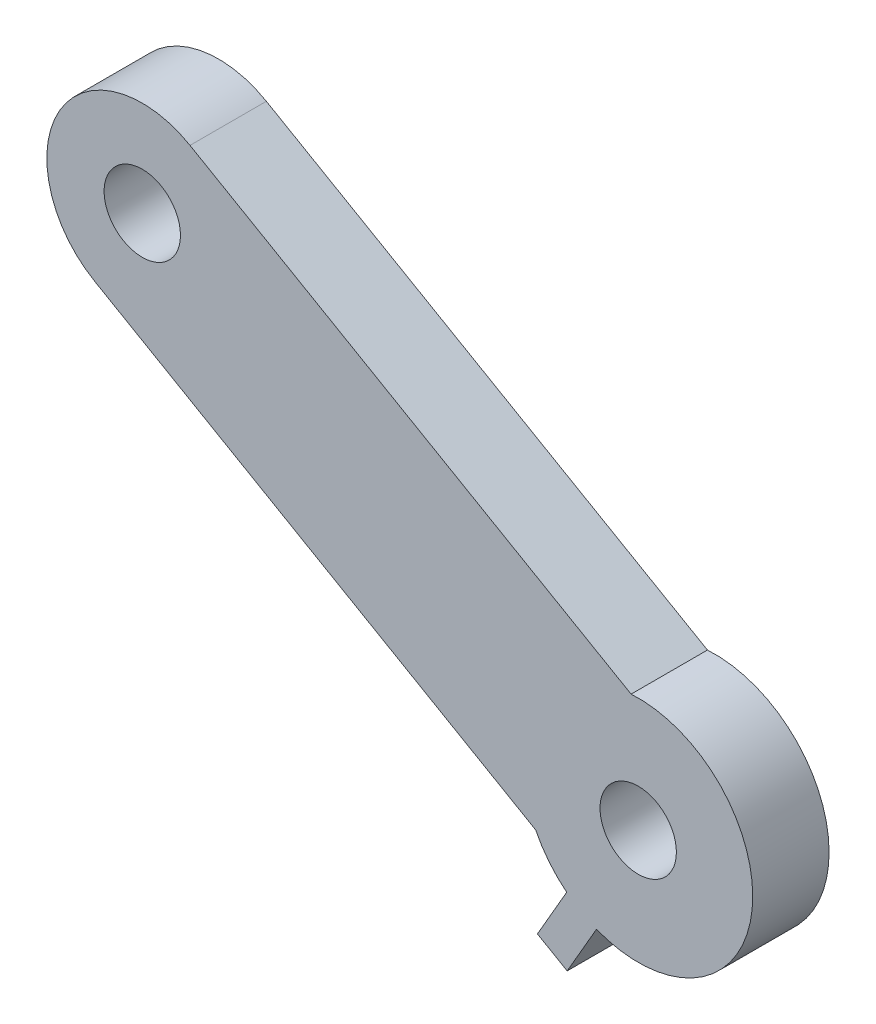
ISO-10303-21;
HEADER;
FILE_DESCRIPTION(('STEP AP214'),'2;1');
FILE_NAME('part.step','',(''),(''),'','','');
FILE_SCHEMA(('AUTOMOTIVE_DESIGN { 1 0 10303 214 1 1 1 1 }'));
ENDSEC;
DATA;
#1=APPLICATION_CONTEXT('core data for automotive mechanical design processes');
#2=APPLICATION_PROTOCOL_DEFINITION('international standard','automotive_design',2000,#1);
#3=PRODUCT_CONTEXT('',#1,'mechanical');
#4=PRODUCT('Part','Part','',(#3));
#5=PRODUCT_RELATED_PRODUCT_CATEGORY('part','',(#4));
#6=PRODUCT_DEFINITION_FORMATION('','',#4);
#7=PRODUCT_DEFINITION_CONTEXT('part definition',#1,'design');
#8=PRODUCT_DEFINITION('design','',#6,#7);
#9=PRODUCT_DEFINITION_SHAPE('','',#8);
#10=(LENGTH_UNIT() NAMED_UNIT(*) SI_UNIT(.MILLI.,.METRE.));
#11=(NAMED_UNIT(*) PLANE_ANGLE_UNIT() SI_UNIT($,.RADIAN.));
#12=(NAMED_UNIT(*) SI_UNIT($,.STERADIAN.) SOLID_ANGLE_UNIT());
#13=UNCERTAINTY_MEASURE_WITH_UNIT(LENGTH_MEASURE(1.E-05),#10,'distance_accuracy_value','');
#14=(GEOMETRIC_REPRESENTATION_CONTEXT(3) GLOBAL_UNCERTAINTY_ASSIGNED_CONTEXT((#13)) GLOBAL_UNIT_ASSIGNED_CONTEXT((#10,
#11,#12)) REPRESENTATION_CONTEXT('',''));
#15=CARTESIAN_POINT('',(0.,0.,0.));
#16=DIRECTION('',(0.,0.,1.));
#17=DIRECTION('',(1.,0.,0.));
#18=AXIS2_PLACEMENT_3D('',#15,#16,#17);
#19=CARTESIAN_POINT('',(0.,0.,20.));
#20=DIRECTION('',(0.,0.,-1.));
#21=DIRECTION('',(-1.,0.,0.));
#22=AXIS2_PLACEMENT_3D('',#19,#20,#21);
#23=CYLINDRICAL_SURFACE('',#22,30.);
#24=CARTESIAN_POINT('',(0.,0.,0.));
#25=DIRECTION('',(0.,0.,1.));
#26=DIRECTION('',(1.,0.,0.));
#27=AXIS2_PLACEMENT_3D('',#24,#25,#26);
#28=CIRCLE('',#27,30.);
#29=CARTESIAN_POINT('',(-26.8614070288252,-13.3590722893387,0.));
#30=VERTEX_POINT('',#29);
#31=CARTESIAN_POINT('',(-18.7274042669941,-23.4368156843154,0.));
#32=VERTEX_POINT('',#31);
#33=EDGE_CURVE('E148',#30,#32,#28,.T.);
#34=ORIENTED_EDGE('',*,*,#33,.T.);
#35=DIRECTION('',(0.,0.,-1.));
#36=VECTOR('',#35,1.);
#37=CARTESIAN_POINT('',(-18.7274042669941,-23.4368156843154,20.));
#38=LINE('',#37,#36);
#39=CARTESIAN_POINT('',(-18.7274042669941,-23.4368156843154,20.));
#40=VERTEX_POINT('',#39);
#41=EDGE_CURVE('E11',#40,#32,#38,.T.);
#42=ORIENTED_EDGE('',*,*,#41,.F.);
#43=CARTESIAN_POINT('',(0.,0.,20.));
#44=DIRECTION('',(0.,0.,1.));
#45=DIRECTION('',(1.,0.,0.));
#46=AXIS2_PLACEMENT_3D('',#43,#44,#45);
#47=CIRCLE('',#46,30.);
#48=CARTESIAN_POINT('',(-26.8614070288252,-13.3590722893387,20.));
#49=VERTEX_POINT('',#48);
#50=EDGE_CURVE('E136',#49,#40,#47,.T.);
#51=ORIENTED_EDGE('',*,*,#50,.F.);
#52=DIRECTION('',(0.,0.,-1.));
#53=VECTOR('',#52,1.);
#54=CARTESIAN_POINT('',(-26.8614070288252,-13.3590722893387,20.));
#55=LINE('',#54,#53);
#56=EDGE_CURVE('E147',#49,#30,#55,.T.);
#57=ORIENTED_EDGE('',*,*,#56,.T.);
#58=EDGE_LOOP('',(#34,#42,#51,#57));
#59=FACE_BOUND('',#58,.T.);
#60=ADVANCED_FACE('F40',(#59),#23,.T.);
#61=CARTESIAN_POINT('',(-3.89711431702996,2.25000000000004,20.));
#62=DIRECTION('',(0.866025403784435,-0.500000000000007,0.));
#63=DIRECTION('',(0.500000000000007,0.866025403784435,0.));
#64=AXIS2_PLACEMENT_3D('',#61,#62,#63);
#65=PLANE('',#64);
#66=DIRECTION('',(-0.500000000000007,-0.866025403784435,0.));
#67=VECTOR('',#66,1.);
#68=CARTESIAN_POINT('',(-3.89711431702996,2.25000000000004,0.));
#69=LINE('',#68,#67);
#70=CARTESIAN_POINT('',(-26.3971143170303,-36.7211431702995,0.));
#71=VERTEX_POINT('',#70);
#72=EDGE_CURVE('E151',#32,#71,#69,.T.);
#73=ORIENTED_EDGE('',*,*,#72,.T.);
#74=DIRECTION('',(0.,0.,-1.));
#75=VECTOR('',#74,1.);
#76=CARTESIAN_POINT('',(-26.3971143170303,-36.7211431702995,20.));
#77=LINE('',#76,#75);
#78=CARTESIAN_POINT('',(-26.3971143170303,-36.7211431702995,20.));
#79=VERTEX_POINT('',#78);
#80=EDGE_CURVE('E49',#79,#71,#77,.T.);
#81=ORIENTED_EDGE('',*,*,#80,.F.);
#82=DIRECTION('',(-0.500000000000007,-0.866025403784435,0.));
#83=VECTOR('',#82,1.);
#84=CARTESIAN_POINT('',(-3.89711431702996,2.25000000000004,20.));
#85=LINE('',#84,#83);
#86=EDGE_CURVE('E99',#40,#79,#85,.T.);
#87=ORIENTED_EDGE('',*,*,#86,.F.);
#88=ORIENTED_EDGE('',*,*,#41,.T.);
#89=EDGE_LOOP('',(#73,#81,#87,#88));
#90=FACE_BOUND('',#89,.T.);
#91=ADVANCED_FACE('F42',(#90),#65,.F.);
#92=CARTESIAN_POINT('',(-22.5000000000001,-38.9711431702996,20.));
#93=DIRECTION('',(0.500000000000003,0.866025403784437,0.));
#94=DIRECTION('',(-0.866025403784437,0.500000000000003,0.));
#95=AXIS2_PLACEMENT_3D('',#92,#93,#94);
#96=PLANE('',#95);
#97=DIRECTION('',(0.866025403784437,-0.500000000000003,0.));
#98=VECTOR('',#97,1.);
#99=CARTESIAN_POINT('',(-22.5000000000001,-38.9711431702996,0.));
#100=LINE('',#99,#98);
#101=CARTESIAN_POINT('',(-18.6028856829704,-41.2211431702996,0.));
#102=VERTEX_POINT('',#101);
#103=EDGE_CURVE('E154',#71,#102,#100,.T.);
#104=ORIENTED_EDGE('',*,*,#103,.T.);
#105=DIRECTION('',(0.,0.,-1.));
#106=VECTOR('',#105,1.);
#107=CARTESIAN_POINT('',(-18.6028856829704,-41.2211431702996,20.));
#108=LINE('',#107,#106);
#109=CARTESIAN_POINT('',(-18.6028856829704,-41.2211431702996,20.));
#110=VERTEX_POINT('',#109);
#111=EDGE_CURVE('E174',#110,#102,#108,.T.);
#112=ORIENTED_EDGE('',*,*,#111,.F.);
#113=DIRECTION('',(0.866025403784437,-0.500000000000003,0.));
#114=VECTOR('',#113,1.);
#115=CARTESIAN_POINT('',(-22.5000000000001,-38.9711431702996,20.));
#116=LINE('',#115,#114);
#117=EDGE_CURVE('E181',#79,#110,#116,.T.);
#118=ORIENTED_EDGE('',*,*,#117,.F.);
#119=ORIENTED_EDGE('',*,*,#80,.T.);
#120=EDGE_LOOP('',(#104,#112,#118,#119));
#121=FACE_BOUND('',#120,.T.);
#122=ADVANCED_FACE('F179',(#121),#96,.F.);
#123=CARTESIAN_POINT('',(3.89711431702996,-2.25000000000004,20.));
#124=DIRECTION('',(0.866025403784434,-0.500000000000007,0.));
#125=DIRECTION('',(0.500000000000008,0.866025403784434,0.));
#126=AXIS2_PLACEMENT_3D('',#123,#124,#125);
#127=PLANE('',#126);
#128=DIRECTION('',(-0.500000000000008,-0.866025403784434,0.));
#129=VECTOR('',#128,1.);
#130=CARTESIAN_POINT('',(3.89711431702996,-2.25000000000004,0.));
#131=LINE('',#130,#129);
#132=CARTESIAN_POINT('',(-10.9331756329342,-27.9368156843155,0.));
#133=VERTEX_POINT('',#132);
#134=EDGE_CURVE('E157',#133,#102,#131,.T.);
#135=ORIENTED_EDGE('',*,*,#134,.F.);
#136=DIRECTION('',(0.,0.,-1.));
#137=VECTOR('',#136,1.);
#138=CARTESIAN_POINT('',(-10.9331756329342,-27.9368156843155,20.));
#139=LINE('',#138,#137);
#140=CARTESIAN_POINT('',(-10.9331756329342,-27.9368156843155,20.));
#141=VERTEX_POINT('',#140);
#142=EDGE_CURVE('E172',#141,#133,#139,.T.);
#143=ORIENTED_EDGE('',*,*,#142,.F.);
#144=DIRECTION('',(-0.500000000000008,-0.866025403784434,0.));
#145=VECTOR('',#144,1.);
#146=CARTESIAN_POINT('',(3.89711431702996,-2.25000000000004,20.));
#147=LINE('',#146,#145);
#148=EDGE_CURVE('E134',#141,#110,#147,.T.);
#149=ORIENTED_EDGE('',*,*,#148,.T.);
#150=ORIENTED_EDGE('',*,*,#111,.T.);
#151=EDGE_LOOP('',(#135,#143,#149,#150));
#152=FACE_BOUND('',#151,.T.);
#153=ADVANCED_FACE('F190',(#152),#127,.T.);
#154=CARTESIAN_POINT('',(-1.86140569183758,29.942197127973,0.));
#155=VERTEX_POINT('',#154);
#156=EDGE_CURVE('E152',#133,#155,#28,.T.);
#157=ORIENTED_EDGE('',*,*,#156,.T.);
#158=DIRECTION('',(0.,0.,-1.));
#159=VECTOR('',#158,1.);
#160=CARTESIAN_POINT('',(-1.86140569183758,29.942197127973,20.));
#161=LINE('',#160,#159);
#162=CARTESIAN_POINT('',(-1.86140569183758,29.942197127973,20.));
#163=VERTEX_POINT('',#162);
#164=EDGE_CURVE('E121',#163,#155,#161,.T.);
#165=ORIENTED_EDGE('',*,*,#164,.F.);
#166=EDGE_CURVE('E131',#141,#163,#47,.T.);
#167=ORIENTED_EDGE('',*,*,#166,.F.);
#168=ORIENTED_EDGE('',*,*,#142,.T.);
#169=EDGE_LOOP('',(#157,#165,#167,#168));
#170=FACE_BOUND('',#169,.T.);
#171=ADVANCED_FACE('F202',(#170),#23,.T.);
#172=CARTESIAN_POINT('',(12.5000002560137,21.6506355380395,20.));
#173=DIRECTION('',(0.500000000000004,0.866025403784436,0.));
#174=DIRECTION('',(-0.866025403784436,0.500000000000004,0.));
#175=AXIS2_PLACEMENT_3D('',#172,#173,#174);
#176=PLANE('',#175);
#177=DIRECTION('',(0.866025403784436,-0.500000000000004,0.));
#178=VECTOR('',#177,1.);
#179=CARTESIAN_POINT('',(12.5000002560137,21.6506355380395,0.));
#180=LINE('',#179,#178);
#181=CARTESIAN_POINT('',(-117.403809643158,96.650635152085,0.));
#182=VERTEX_POINT('',#181);
#183=EDGE_CURVE('E120',#182,#155,#180,.T.);
#184=ORIENTED_EDGE('',*,*,#183,.F.);
#185=DIRECTION('',(0.,0.,-1.));
#186=VECTOR('',#185,1.);
#187=CARTESIAN_POINT('',(-117.403809643158,96.650635152085,20.));
#188=LINE('',#187,#186);
#189=CARTESIAN_POINT('',(-117.403809643158,96.650635152085,20.));
#190=VERTEX_POINT('',#189);
#191=EDGE_CURVE('E114',#190,#182,#188,.T.);
#192=ORIENTED_EDGE('',*,*,#191,.F.);
#193=DIRECTION('',(0.866025403784436,-0.500000000000004,0.));
#194=VECTOR('',#193,1.);
#195=CARTESIAN_POINT('',(12.5000002560137,21.6506355380395,20.));
#196=LINE('',#195,#194);
#197=EDGE_CURVE('E118',#190,#163,#196,.T.);
#198=ORIENTED_EDGE('',*,*,#197,.T.);
#199=ORIENTED_EDGE('',*,*,#164,.T.);
#200=EDGE_LOOP('',(#184,#192,#198,#199));
#201=FACE_BOUND('',#200,.T.);
#202=ADVANCED_FACE('F116',(#201),#176,.T.);
#203=CARTESIAN_POINT('',(-129.903810311652,75.0000004434292,20.));
#204=DIRECTION('',(0.,0.,-1.));
#205=DIRECTION('',(-1.,0.,0.));
#206=AXIS2_PLACEMENT_3D('',#203,#204,#205);
#207=CYLINDRICAL_SURFACE('',#206,25.);
#208=CARTESIAN_POINT('',(-129.903810311652,75.0000004434292,0.));
#209=DIRECTION('',(0.,0.,1.));
#210=DIRECTION('',(1.,0.,0.));
#211=AXIS2_PLACEMENT_3D('',#208,#209,#210);
#212=CIRCLE('',#211,25.);
#213=CARTESIAN_POINT('',(-142.403810980146,53.3493657347733,0.));
#214=VERTEX_POINT('',#213);
#215=EDGE_CURVE('E85',#182,#214,#212,.T.);
#216=ORIENTED_EDGE('',*,*,#215,.T.);
#217=DIRECTION('',(0.,0.,-1.));
#218=VECTOR('',#217,1.);
#219=CARTESIAN_POINT('',(-142.403810980146,53.3493657347733,20.));
#220=LINE('',#219,#218);
#221=CARTESIAN_POINT('',(-142.403810980146,53.3493657347733,20.));
#222=VERTEX_POINT('',#221);
#223=EDGE_CURVE('E122',#222,#214,#220,.T.);
#224=ORIENTED_EDGE('',*,*,#223,.F.);
#225=CARTESIAN_POINT('',(-129.903810311652,75.0000004434292,20.));
#226=DIRECTION('',(0.,0.,1.));
#227=DIRECTION('',(1.,0.,0.));
#228=AXIS2_PLACEMENT_3D('',#225,#226,#227);
#229=CIRCLE('',#228,25.);
#230=EDGE_CURVE('E124',#190,#222,#229,.T.);
#231=ORIENTED_EDGE('',*,*,#230,.F.);
#232=ORIENTED_EDGE('',*,*,#191,.T.);
#233=EDGE_LOOP('',(#216,#224,#231,#232));
#234=FACE_BOUND('',#233,.T.);
#235=ADVANCED_FACE('F125',(#234),#207,.T.);
#236=CARTESIAN_POINT('',(0.,0.,20.));
#237=DIRECTION('',(0.,0.,-1.));
#238=DIRECTION('',(-1.,0.,0.));
#239=AXIS2_PLACEMENT_3D('',#236,#237,#238);
#240=CYLINDRICAL_SURFACE('',#239,10.);
#241=CARTESIAN_POINT('',(0.,0.,20.));
#242=DIRECTION('',(0.,0.,1.));
#243=DIRECTION('',(1.,0.,0.));
#244=AXIS2_PLACEMENT_3D('',#241,#242,#243);
#245=CIRCLE('',#244,10.);
#246=CARTESIAN_POINT('',(10.,0.,20.));
#247=VERTEX_POINT('',#246);
#248=EDGE_CURVE('E141',#247,#247,#245,.T.);
#249=ORIENTED_EDGE('',*,*,#248,.T.);
#250=EDGE_LOOP('',(#249));
#251=FACE_BOUND('',#250,.T.);
#252=CARTESIAN_POINT('',(0.,0.,0.));
#253=DIRECTION('',(0.,0.,1.));
#254=DIRECTION('',(1.,0.,0.));
#255=AXIS2_PLACEMENT_3D('',#252,#253,#254);
#256=CIRCLE('',#255,10.);
#257=CARTESIAN_POINT('',(10.,0.,0.));
#258=VERTEX_POINT('',#257);
#259=EDGE_CURVE('E163',#258,#258,#256,.T.);
#260=ORIENTED_EDGE('',*,*,#259,.F.);
#261=EDGE_LOOP('',(#260));
#262=FACE_BOUND('',#261,.T.);
#263=ADVANCED_FACE('F257',(#251,#262),#240,.F.);
#264=CARTESIAN_POINT('',(-12.4999997439865,-21.6506346511823,20.));
#265=DIRECTION('',(0.500000000000004,0.866025403784436,0.));
#266=DIRECTION('',(-0.866025403784436,0.500000000000004,0.));
#267=AXIS2_PLACEMENT_3D('',#264,#265,#266);
#268=PLANE('',#267);
#269=DIRECTION('',(0.866025403784436,-0.500000000000004,0.));
#270=VECTOR('',#269,1.);
#271=CARTESIAN_POINT('',(-12.4999997439865,-21.6506346511823,0.));
#272=LINE('',#271,#270);
#273=EDGE_CURVE('E91',#214,#30,#272,.T.);
#274=ORIENTED_EDGE('',*,*,#273,.T.);
#275=ORIENTED_EDGE('',*,*,#56,.F.);
#276=DIRECTION('',(0.866025403784436,-0.500000000000004,0.));
#277=VECTOR('',#276,1.);
#278=CARTESIAN_POINT('',(-12.4999997439865,-21.6506346511823,20.));
#279=LINE('',#278,#277);
#280=EDGE_CURVE('E57',#222,#49,#279,.T.);
#281=ORIENTED_EDGE('',*,*,#280,.F.);
#282=ORIENTED_EDGE('',*,*,#223,.T.);
#283=EDGE_LOOP('',(#274,#275,#281,#282));
#284=FACE_BOUND('',#283,.T.);
#285=ADVANCED_FACE('F266',(#284),#268,.F.);
#286=CARTESIAN_POINT('',(-129.903810311652,75.0000004434292,20.));
#287=DIRECTION('',(0.,0.,-1.));
#288=DIRECTION('',(-1.,0.,0.));
#289=AXIS2_PLACEMENT_3D('',#286,#287,#288);
#290=CYLINDRICAL_SURFACE('',#289,9.99999999999999);
#291=CARTESIAN_POINT('',(-129.903810311652,75.0000004434292,20.));
#292=DIRECTION('',(0.,0.,1.));
#293=DIRECTION('',(1.,0.,0.));
#294=AXIS2_PLACEMENT_3D('',#291,#292,#293);
#295=CIRCLE('',#294,9.99999999999999);
#296=CARTESIAN_POINT('',(-119.903810311652,75.0000004434292,20.));
#297=VERTEX_POINT('',#296);
#298=EDGE_CURVE('E144',#297,#297,#295,.T.);
#299=ORIENTED_EDGE('',*,*,#298,.T.);
#300=EDGE_LOOP('',(#299));
#301=FACE_BOUND('',#300,.T.);
#302=CARTESIAN_POINT('',(-129.903810311652,75.0000004434292,0.));
#303=DIRECTION('',(0.,0.,1.));
#304=DIRECTION('',(1.,0.,0.));
#305=AXIS2_PLACEMENT_3D('',#302,#303,#304);
#306=CIRCLE('',#305,9.99999999999999);
#307=CARTESIAN_POINT('',(-119.903810311652,75.0000004434292,0.));
#308=VERTEX_POINT('',#307);
#309=EDGE_CURVE('E166',#308,#308,#306,.T.);
#310=ORIENTED_EDGE('',*,*,#309,.F.);
#311=EDGE_LOOP('',(#310));
#312=FACE_BOUND('',#311,.T.);
#313=ADVANCED_FACE('F276',(#301,#312),#290,.F.);
#314=CARTESIAN_POINT('',(0.,0.,20.));
#315=DIRECTION('',(0.,0.,1.));
#316=DIRECTION('',(1.,0.,0.));
#317=AXIS2_PLACEMENT_3D('',#314,#315,#316);
#318=PLANE('',#317);
#319=ORIENTED_EDGE('',*,*,#50,.T.);
#320=ORIENTED_EDGE('',*,*,#86,.T.);
#321=ORIENTED_EDGE('',*,*,#117,.T.);
#322=ORIENTED_EDGE('',*,*,#148,.F.);
#323=ORIENTED_EDGE('',*,*,#166,.T.);
#324=ORIENTED_EDGE('',*,*,#197,.F.);
#325=ORIENTED_EDGE('',*,*,#230,.T.);
#326=ORIENTED_EDGE('',*,*,#280,.T.);
#327=EDGE_LOOP('',(#319,#320,#321,#322,#323,#324,#325,#326));
#328=FACE_BOUND('',#327,.T.);
#329=ORIENTED_EDGE('',*,*,#248,.F.);
#330=EDGE_LOOP('',(#329));
#331=FACE_BOUND('',#330,.T.);
#332=ORIENTED_EDGE('',*,*,#298,.F.);
#333=EDGE_LOOP('',(#332));
#334=FACE_BOUND('',#333,.T.);
#335=ADVANCED_FACE('F127',(#328,#331,#334),#318,.T.);
#336=CARTESIAN_POINT('',(0.,0.,0.));
#337=DIRECTION('',(0.,0.,1.));
#338=DIRECTION('',(1.,0.,0.));
#339=AXIS2_PLACEMENT_3D('',#336,#337,#338);
#340=PLANE('',#339);
#341=ORIENTED_EDGE('',*,*,#33,.F.);
#342=ORIENTED_EDGE('',*,*,#273,.F.);
#343=ORIENTED_EDGE('',*,*,#215,.F.);
#344=ORIENTED_EDGE('',*,*,#183,.T.);
#345=ORIENTED_EDGE('',*,*,#156,.F.);
#346=ORIENTED_EDGE('',*,*,#134,.T.);
#347=ORIENTED_EDGE('',*,*,#103,.F.);
#348=ORIENTED_EDGE('',*,*,#72,.F.);
#349=EDGE_LOOP('',(#341,#342,#343,#344,#345,#346,#347,#348));
#350=FACE_BOUND('',#349,.T.);
#351=ORIENTED_EDGE('',*,*,#259,.T.);
#352=EDGE_LOOP('',(#351));
#353=FACE_BOUND('',#352,.T.);
#354=ORIENTED_EDGE('',*,*,#309,.T.);
#355=EDGE_LOOP('',(#354));
#356=FACE_BOUND('',#355,.T.);
#357=ADVANCED_FACE('F184',(#350,#353,#356),#340,.F.);
#358=CLOSED_SHELL('',(#60,#91,#122,#153,#171,#202,#235,#263,#285,#313,#335,#357));
#359=MANIFOLD_SOLID_BREP('B2',#358);
#360=ADVANCED_BREP_SHAPE_REPRESENTATION('',(#18,#359),#14);
#361=SHAPE_DEFINITION_REPRESENTATION(#9,#360);
ENDSEC;
END-ISO-10303-21;
